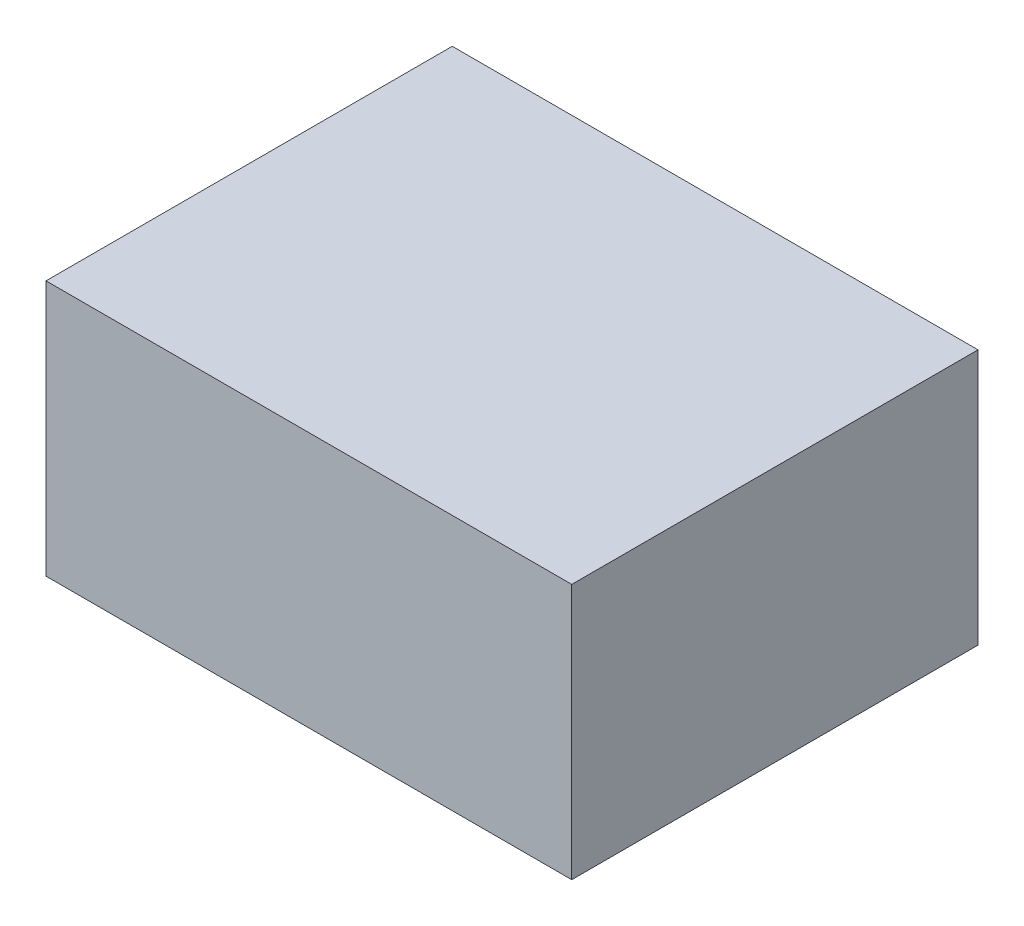
ISO-10303-21;
HEADER;
FILE_DESCRIPTION(('STEP AP214'),'2;1');
FILE_NAME('part.step','',(''),(''),'','','');
FILE_SCHEMA(('AUTOMOTIVE_DESIGN { 1 0 10303 214 1 1 1 1 }'));
ENDSEC;
DATA;
#1=APPLICATION_CONTEXT('core data for automotive mechanical design processes');
#2=APPLICATION_PROTOCOL_DEFINITION('international standard','automotive_design',2000,#1);
#3=PRODUCT_CONTEXT('',#1,'mechanical');
#4=PRODUCT('Part','Part','',(#3));
#5=PRODUCT_RELATED_PRODUCT_CATEGORY('part','',(#4));
#6=PRODUCT_DEFINITION_FORMATION('','',#4);
#7=PRODUCT_DEFINITION_CONTEXT('part definition',#1,'design');
#8=PRODUCT_DEFINITION('design','',#6,#7);
#9=PRODUCT_DEFINITION_SHAPE('','',#8);
#10=(LENGTH_UNIT() NAMED_UNIT(*) SI_UNIT(.MILLI.,.METRE.));
#11=(NAMED_UNIT(*) PLANE_ANGLE_UNIT() SI_UNIT($,.RADIAN.));
#12=(NAMED_UNIT(*) SI_UNIT($,.STERADIAN.) SOLID_ANGLE_UNIT());
#13=UNCERTAINTY_MEASURE_WITH_UNIT(LENGTH_MEASURE(1.E-05),#10,'distance_accuracy_value','');
#14=(GEOMETRIC_REPRESENTATION_CONTEXT(3) GLOBAL_UNCERTAINTY_ASSIGNED_CONTEXT((#13)) GLOBAL_UNIT_ASSIGNED_CONTEXT((#10,
#11,#12)) REPRESENTATION_CONTEXT('',''));
#15=CARTESIAN_POINT('',(0.,0.,0.));
#16=DIRECTION('',(0.,0.,1.));
#17=DIRECTION('',(1.,0.,0.));
#18=AXIS2_PLACEMENT_3D('',#15,#16,#17);
#19=CARTESIAN_POINT('',(0.,15.24,0.));
#20=DIRECTION('',(1.,0.,0.));
#21=DIRECTION('',(0.,0.,-1.));
#22=AXIS2_PLACEMENT_3D('',#19,#20,#21);
#23=PLANE('',#22);
#24=DIRECTION('',(0.,0.,1.));
#25=VECTOR('',#24,1.);
#26=CARTESIAN_POINT('',(0.,0.,0.));
#27=LINE('',#26,#25);
#28=CARTESIAN_POINT('',(0.,0.,0.));
#29=VERTEX_POINT('',#28);
#30=CARTESIAN_POINT('',(0.,0.,24.2066532620601));
#31=VERTEX_POINT('',#30);
#32=EDGE_CURVE('E113',#29,#31,#27,.T.);
#33=ORIENTED_EDGE('',*,*,#32,.T.);
#34=DIRECTION('',(0.,-1.,0.));
#35=VECTOR('',#34,1.);
#36=CARTESIAN_POINT('',(0.,15.24,24.2066532620601));
#37=LINE('',#36,#35);
#38=CARTESIAN_POINT('',(0.,15.24,24.2066532620601));
#39=VERTEX_POINT('',#38);
#40=EDGE_CURVE('E11',#39,#31,#37,.T.);
#41=ORIENTED_EDGE('',*,*,#40,.F.);
#42=DIRECTION('',(0.,0.,1.));
#43=VECTOR('',#42,1.);
#44=CARTESIAN_POINT('',(0.,15.24,0.));
#45=LINE('',#44,#43);
#46=CARTESIAN_POINT('',(0.,15.24,0.));
#47=VERTEX_POINT('',#46);
#48=EDGE_CURVE('E97',#47,#39,#45,.T.);
#49=ORIENTED_EDGE('',*,*,#48,.F.);
#50=DIRECTION('',(0.,-1.,0.));
#51=VECTOR('',#50,1.);
#52=CARTESIAN_POINT('',(0.,15.24,0.));
#53=LINE('',#52,#51);
#54=EDGE_CURVE('E109',#47,#29,#53,.T.);
#55=ORIENTED_EDGE('',*,*,#54,.T.);
#56=EDGE_LOOP('',(#33,#41,#49,#55));
#57=FACE_BOUND('',#56,.T.);
#58=ADVANCED_FACE('F45',(#57),#23,.F.);
#59=CARTESIAN_POINT('',(0.,15.24,24.2066532620601));
#60=DIRECTION('',(0.,0.,-1.));
#61=DIRECTION('',(-1.,0.,0.));
#62=AXIS2_PLACEMENT_3D('',#59,#60,#61);
#63=PLANE('',#62);
#64=DIRECTION('',(1.,0.,0.));
#65=VECTOR('',#64,1.);
#66=CARTESIAN_POINT('',(0.,0.,24.2066532620601));
#67=LINE('',#66,#65);
#68=CARTESIAN_POINT('',(31.326257162666,0.,24.2066532620601));
#69=VERTEX_POINT('',#68);
#70=EDGE_CURVE('E102',#31,#69,#67,.T.);
#71=ORIENTED_EDGE('',*,*,#70,.T.);
#72=DIRECTION('',(0.,-1.,0.));
#73=VECTOR('',#72,1.);
#74=CARTESIAN_POINT('',(31.326257162666,15.24,24.2066532620601));
#75=LINE('',#74,#73);
#76=CARTESIAN_POINT('',(31.326257162666,15.24,24.2066532620601));
#77=VERTEX_POINT('',#76);
#78=EDGE_CURVE('E54',#77,#69,#75,.T.);
#79=ORIENTED_EDGE('',*,*,#78,.F.);
#80=DIRECTION('',(1.,0.,0.));
#81=VECTOR('',#80,1.);
#82=CARTESIAN_POINT('',(0.,15.24,24.2066532620601));
#83=LINE('',#82,#81);
#84=EDGE_CURVE('E92',#39,#77,#83,.T.);
#85=ORIENTED_EDGE('',*,*,#84,.F.);
#86=ORIENTED_EDGE('',*,*,#40,.T.);
#87=EDGE_LOOP('',(#71,#79,#85,#86));
#88=FACE_BOUND('',#87,.T.);
#89=ADVANCED_FACE('F101',(#88),#63,.F.);
#90=CARTESIAN_POINT('',(31.326257162666,15.24,0.));
#91=DIRECTION('',(-1.,0.,0.));
#92=DIRECTION('',(0.,0.,1.));
#93=AXIS2_PLACEMENT_3D('',#90,#91,#92);
#94=PLANE('',#93);
#95=DIRECTION('',(0.,0.,-1.));
#96=VECTOR('',#95,1.);
#97=CARTESIAN_POINT('',(31.326257162666,0.,0.));
#98=LINE('',#97,#96);
#99=CARTESIAN_POINT('',(31.326257162666,0.,0.));
#100=VERTEX_POINT('',#99);
#101=EDGE_CURVE('E79',#69,#100,#98,.T.);
#102=ORIENTED_EDGE('',*,*,#101,.T.);
#103=DIRECTION('',(0.,-1.,0.));
#104=VECTOR('',#103,1.);
#105=CARTESIAN_POINT('',(31.326257162666,15.24,0.));
#106=LINE('',#105,#104);
#107=CARTESIAN_POINT('',(31.326257162666,15.24,0.));
#108=VERTEX_POINT('',#107);
#109=EDGE_CURVE('E104',#108,#100,#106,.T.);
#110=ORIENTED_EDGE('',*,*,#109,.F.);
#111=DIRECTION('',(0.,0.,-1.));
#112=VECTOR('',#111,1.);
#113=CARTESIAN_POINT('',(31.326257162666,15.24,0.));
#114=LINE('',#113,#112);
#115=EDGE_CURVE('E95',#77,#108,#114,.T.);
#116=ORIENTED_EDGE('',*,*,#115,.F.);
#117=ORIENTED_EDGE('',*,*,#78,.T.);
#118=EDGE_LOOP('',(#102,#110,#116,#117));
#119=FACE_BOUND('',#118,.T.);
#120=ADVANCED_FACE('F105',(#119),#94,.F.);
#121=CARTESIAN_POINT('',(0.,15.24,0.));
#122=DIRECTION('',(0.,0.,1.));
#123=DIRECTION('',(1.,0.,0.));
#124=AXIS2_PLACEMENT_3D('',#121,#122,#123);
#125=PLANE('',#124);
#126=DIRECTION('',(-1.,0.,0.));
#127=VECTOR('',#126,1.);
#128=CARTESIAN_POINT('',(0.,0.,0.));
#129=LINE('',#128,#127);
#130=EDGE_CURVE('E85',#100,#29,#129,.T.);
#131=ORIENTED_EDGE('',*,*,#130,.T.);
#132=ORIENTED_EDGE('',*,*,#54,.F.);
#133=DIRECTION('',(-1.,0.,0.));
#134=VECTOR('',#133,1.);
#135=CARTESIAN_POINT('',(0.,15.24,0.));
#136=LINE('',#135,#134);
#137=EDGE_CURVE('E62',#108,#47,#136,.T.);
#138=ORIENTED_EDGE('',*,*,#137,.F.);
#139=ORIENTED_EDGE('',*,*,#109,.T.);
#140=EDGE_LOOP('',(#131,#132,#138,#139));
#141=FACE_BOUND('',#140,.T.);
#142=ADVANCED_FACE('F126',(#141),#125,.F.);
#143=CARTESIAN_POINT('',(0.,15.24,0.));
#144=DIRECTION('',(0.,1.,0.));
#145=DIRECTION('',(0.,0.,1.));
#146=AXIS2_PLACEMENT_3D('',#143,#144,#145);
#147=PLANE('',#146);
#148=ORIENTED_EDGE('',*,*,#48,.T.);
#149=ORIENTED_EDGE('',*,*,#84,.T.);
#150=ORIENTED_EDGE('',*,*,#115,.T.);
#151=ORIENTED_EDGE('',*,*,#137,.T.);
#152=EDGE_LOOP('',(#148,#149,#150,#151));
#153=FACE_BOUND('',#152,.T.);
#154=ADVANCED_FACE('F93',(#153),#147,.T.);
#155=CARTESIAN_POINT('',(0.,0.,0.));
#156=DIRECTION('',(0.,1.,0.));
#157=DIRECTION('',(0.,0.,1.));
#158=AXIS2_PLACEMENT_3D('',#155,#156,#157);
#159=PLANE('',#158);
#160=ORIENTED_EDGE('',*,*,#32,.F.);
#161=ORIENTED_EDGE('',*,*,#130,.F.);
#162=ORIENTED_EDGE('',*,*,#101,.F.);
#163=ORIENTED_EDGE('',*,*,#70,.F.);
#164=EDGE_LOOP('',(#160,#161,#162,#163));
#165=FACE_BOUND('',#164,.T.);
#166=ADVANCED_FACE('F129',(#165),#159,.F.);
#167=CLOSED_SHELL('',(#58,#89,#120,#142,#154,#166));
#168=MANIFOLD_SOLID_BREP('B2',#167);
#169=ADVANCED_BREP_SHAPE_REPRESENTATION('',(#18,#168),#14);
#170=SHAPE_DEFINITION_REPRESENTATION(#9,#169);
ENDSEC;
END-ISO-10303-21;
